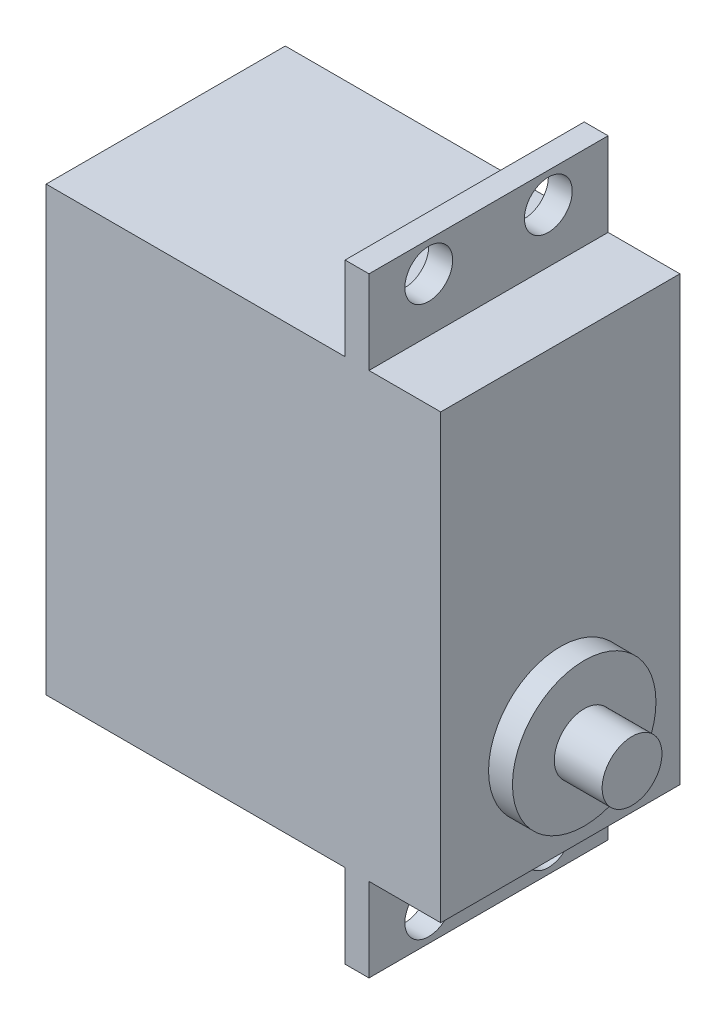
ISO-10303-21;
HEADER;
FILE_DESCRIPTION(('STEP AP214'),'2;1');
FILE_NAME('part.step','',(''),(''),'','','');
FILE_SCHEMA(('AUTOMOTIVE_DESIGN { 1 0 10303 214 1 1 1 1 }'));
ENDSEC;
DATA;
#1=APPLICATION_CONTEXT('core data for automotive mechanical design processes');
#2=APPLICATION_PROTOCOL_DEFINITION('international standard','automotive_design',2000,#1);
#3=PRODUCT_CONTEXT('',#1,'mechanical');
#4=PRODUCT('Part','Part','',(#3));
#5=PRODUCT_RELATED_PRODUCT_CATEGORY('part','',(#4));
#6=PRODUCT_DEFINITION_FORMATION('','',#4);
#7=PRODUCT_DEFINITION_CONTEXT('part definition',#1,'design');
#8=PRODUCT_DEFINITION('design','',#6,#7);
#9=PRODUCT_DEFINITION_SHAPE('','',#8);
#10=(LENGTH_UNIT() NAMED_UNIT(*) SI_UNIT(.MILLI.,.METRE.));
#11=(NAMED_UNIT(*) PLANE_ANGLE_UNIT() SI_UNIT($,.RADIAN.));
#12=(NAMED_UNIT(*) SI_UNIT($,.STERADIAN.) SOLID_ANGLE_UNIT());
#13=UNCERTAINTY_MEASURE_WITH_UNIT(LENGTH_MEASURE(1.E-05),#10,'distance_accuracy_value','');
#14=(GEOMETRIC_REPRESENTATION_CONTEXT(3) GLOBAL_UNCERTAINTY_ASSIGNED_CONTEXT((#13)) GLOBAL_UNIT_ASSIGNED_CONTEXT((#10,
#11,#12)) REPRESENTATION_CONTEXT('',''));
#15=CARTESIAN_POINT('',(0.,0.,0.));
#16=DIRECTION('',(0.,0.,1.));
#17=DIRECTION('',(1.,0.,0.));
#18=AXIS2_PLACEMENT_3D('',#15,#16,#17);
#19=CARTESIAN_POINT('',(0.,37.,0.));
#20=DIRECTION('',(0.,1.,0.));
#21=DIRECTION('',(0.,0.,-1.));
#22=AXIS2_PLACEMENT_3D('',#19,#20,#21);
#23=PLANE('',#22);
#24=DIRECTION('',(1.,0.,0.));
#25=VECTOR('',#24,1.);
#26=CARTESIAN_POINT('',(0.,37.,0.));
#27=LINE('',#26,#25);
#28=CARTESIAN_POINT('',(0.,37.,0.));
#29=VERTEX_POINT('',#28);
#30=CARTESIAN_POINT('',(25.,37.,0.));
#31=VERTEX_POINT('',#30);
#32=EDGE_CURVE('E176',#29,#31,#27,.T.);
#33=ORIENTED_EDGE('',*,*,#32,.T.);
#34=DIRECTION('',(0.,0.,-1.));
#35=VECTOR('',#34,1.);
#36=CARTESIAN_POINT('',(25.,37.,0.));
#37=LINE('',#36,#35);
#38=CARTESIAN_POINT('',(25.,37.,-20.));
#39=VERTEX_POINT('',#38);
#40=EDGE_CURVE('E134',#31,#39,#37,.T.);
#41=ORIENTED_EDGE('',*,*,#40,.T.);
#42=DIRECTION('',(-1.,0.,0.));
#43=VECTOR('',#42,1.);
#44=CARTESIAN_POINT('',(0.,37.,-20.));
#45=LINE('',#44,#43);
#46=CARTESIAN_POINT('',(0.,37.,-20.));
#47=VERTEX_POINT('',#46);
#48=EDGE_CURVE('E168',#39,#47,#45,.T.);
#49=ORIENTED_EDGE('',*,*,#48,.T.);
#50=DIRECTION('',(0.,0.,1.));
#51=VECTOR('',#50,1.);
#52=CARTESIAN_POINT('',(0.,37.,0.));
#53=LINE('',#52,#51);
#54=EDGE_CURVE('E139',#47,#29,#53,.T.);
#55=ORIENTED_EDGE('',*,*,#54,.T.);
#56=EDGE_LOOP('',(#33,#41,#49,#55));
#57=FACE_BOUND('',#56,.T.);
#58=ADVANCED_FACE('F37',(#57),#23,.T.);
#59=CARTESIAN_POINT('',(33.,37.,-20.));
#60=VERTEX_POINT('',#59);
#61=CARTESIAN_POINT('',(27.,37.,-20.));
#62=VERTEX_POINT('',#61);
#63=EDGE_CURVE('E169',#60,#62,#45,.T.);
#64=ORIENTED_EDGE('',*,*,#63,.T.);
#65=DIRECTION('',(0.,0.,1.));
#66=VECTOR('',#65,1.);
#67=CARTESIAN_POINT('',(27.,37.,0.));
#68=LINE('',#67,#66);
#69=CARTESIAN_POINT('',(27.,37.,0.));
#70=VERTEX_POINT('',#69);
#71=EDGE_CURVE('E148',#62,#70,#68,.T.);
#72=ORIENTED_EDGE('',*,*,#71,.T.);
#73=CARTESIAN_POINT('',(33.,37.,0.));
#74=VERTEX_POINT('',#73);
#75=EDGE_CURVE('E175',#70,#74,#27,.T.);
#76=ORIENTED_EDGE('',*,*,#75,.T.);
#77=DIRECTION('',(0.,0.,-1.));
#78=VECTOR('',#77,1.);
#79=CARTESIAN_POINT('',(33.,37.,0.));
#80=LINE('',#79,#78);
#81=EDGE_CURVE('E172',#74,#60,#80,.T.);
#82=ORIENTED_EDGE('',*,*,#81,.T.);
#83=EDGE_LOOP('',(#64,#72,#76,#82));
#84=FACE_BOUND('',#83,.T.);
#85=ADVANCED_FACE('F271',(#84),#23,.T.);
#86=CARTESIAN_POINT('',(0.,0.,0.));
#87=DIRECTION('',(0.,-1.,0.));
#88=DIRECTION('',(0.,0.,-1.));
#89=AXIS2_PLACEMENT_3D('',#86,#87,#88);
#90=PLANE('',#89);
#91=DIRECTION('',(0.,0.,-1.));
#92=VECTOR('',#91,1.);
#93=CARTESIAN_POINT('',(25.,0.,0.));
#94=LINE('',#93,#92);
#95=CARTESIAN_POINT('',(25.,0.,0.));
#96=VERTEX_POINT('',#95);
#97=CARTESIAN_POINT('',(25.,0.,-20.));
#98=VERTEX_POINT('',#97);
#99=EDGE_CURVE('E61',#96,#98,#94,.T.);
#100=ORIENTED_EDGE('',*,*,#99,.F.);
#101=DIRECTION('',(1.,0.,0.));
#102=VECTOR('',#101,1.);
#103=CARTESIAN_POINT('',(0.,0.,0.));
#104=LINE('',#103,#102);
#105=CARTESIAN_POINT('',(0.,0.,0.));
#106=VERTEX_POINT('',#105);
#107=EDGE_CURVE('E207',#106,#96,#104,.T.);
#108=ORIENTED_EDGE('',*,*,#107,.F.);
#109=DIRECTION('',(0.,0.,1.));
#110=VECTOR('',#109,1.);
#111=CARTESIAN_POINT('',(0.,0.,0.));
#112=LINE('',#111,#110);
#113=CARTESIAN_POINT('',(0.,0.,-20.));
#114=VERTEX_POINT('',#113);
#115=EDGE_CURVE('E203',#114,#106,#112,.T.);
#116=ORIENTED_EDGE('',*,*,#115,.F.);
#117=DIRECTION('',(-1.,0.,0.));
#118=VECTOR('',#117,1.);
#119=CARTESIAN_POINT('',(0.,0.,-20.));
#120=LINE('',#119,#118);
#121=EDGE_CURVE('E211',#98,#114,#120,.T.);
#122=ORIENTED_EDGE('',*,*,#121,.F.);
#123=EDGE_LOOP('',(#100,#108,#116,#122));
#124=FACE_BOUND('',#123,.T.);
#125=ADVANCED_FACE('F267',(#124),#90,.T.);
#126=CARTESIAN_POINT('',(0.,18.5,0.));
#127=DIRECTION('',(1.,0.,0.));
#128=DIRECTION('',(0.,0.,-1.));
#129=AXIS2_PLACEMENT_3D('',#126,#127,#128);
#130=PLANE('',#129);
#131=ORIENTED_EDGE('',*,*,#115,.T.);
#132=DIRECTION('',(0.,-1.,0.));
#133=VECTOR('',#132,1.);
#134=CARTESIAN_POINT('',(0.,18.5,0.));
#135=LINE('',#134,#133);
#136=EDGE_CURVE('E223',#29,#106,#135,.T.);
#137=ORIENTED_EDGE('',*,*,#136,.F.);
#138=ORIENTED_EDGE('',*,*,#54,.F.);
#139=DIRECTION('',(0.,-1.,0.));
#140=VECTOR('',#139,1.);
#141=CARTESIAN_POINT('',(0.,18.5,-20.));
#142=LINE('',#141,#140);
#143=EDGE_CURVE('E215',#47,#114,#142,.T.);
#144=ORIENTED_EDGE('',*,*,#143,.T.);
#145=EDGE_LOOP('',(#131,#137,#138,#144));
#146=FACE_BOUND('',#145,.T.);
#147=ADVANCED_FACE('F39',(#146),#130,.F.);
#148=CARTESIAN_POINT('',(0.,18.5,0.));
#149=DIRECTION('',(0.,0.,-1.));
#150=DIRECTION('',(-1.,0.,0.));
#151=AXIS2_PLACEMENT_3D('',#148,#149,#150);
#152=PLANE('',#151);
#153=ORIENTED_EDGE('',*,*,#107,.T.);
#154=DIRECTION('',(0.,1.,0.));
#155=VECTOR('',#154,1.);
#156=CARTESIAN_POINT('',(25.,-7.,0.));
#157=LINE('',#156,#155);
#158=CARTESIAN_POINT('',(25.,-7.,0.));
#159=VERTEX_POINT('',#158);
#160=EDGE_CURVE('E188',#159,#96,#157,.T.);
#161=ORIENTED_EDGE('',*,*,#160,.F.);
#162=DIRECTION('',(-1.,0.,0.));
#163=VECTOR('',#162,1.);
#164=CARTESIAN_POINT('',(25.,-7.,0.));
#165=LINE('',#164,#163);
#166=CARTESIAN_POINT('',(27.,-7.,0.));
#167=VERTEX_POINT('',#166);
#168=EDGE_CURVE('E186',#167,#159,#165,.T.);
#169=ORIENTED_EDGE('',*,*,#168,.F.);
#170=DIRECTION('',(0.,1.,0.));
#171=VECTOR('',#170,1.);
#172=CARTESIAN_POINT('',(27.,-7.,0.));
#173=LINE('',#172,#171);
#174=CARTESIAN_POINT('',(27.,0.,0.));
#175=VERTEX_POINT('',#174);
#176=EDGE_CURVE('E194',#167,#175,#173,.T.);
#177=ORIENTED_EDGE('',*,*,#176,.T.);
#178=CARTESIAN_POINT('',(33.,0.,0.));
#179=VERTEX_POINT('',#178);
#180=EDGE_CURVE('E206',#175,#179,#104,.T.);
#181=ORIENTED_EDGE('',*,*,#180,.T.);
#182=DIRECTION('',(0.,-1.,0.));
#183=VECTOR('',#182,1.);
#184=CARTESIAN_POINT('',(33.,18.5,0.));
#185=LINE('',#184,#183);
#186=EDGE_CURVE('E221',#74,#179,#185,.T.);
#187=ORIENTED_EDGE('',*,*,#186,.F.);
#188=ORIENTED_EDGE('',*,*,#75,.F.);
#189=DIRECTION('',(0.,-1.,0.));
#190=VECTOR('',#189,1.);
#191=CARTESIAN_POINT('',(27.,44.,0.));
#192=LINE('',#191,#190);
#193=CARTESIAN_POINT('',(27.,44.,0.));
#194=VERTEX_POINT('',#193);
#195=EDGE_CURVE('E53',#194,#70,#192,.T.);
#196=ORIENTED_EDGE('',*,*,#195,.F.);
#197=DIRECTION('',(-1.,0.,0.));
#198=VECTOR('',#197,1.);
#199=CARTESIAN_POINT('',(25.,44.,0.));
#200=LINE('',#199,#198);
#201=CARTESIAN_POINT('',(25.,44.,0.));
#202=VERTEX_POINT('',#201);
#203=EDGE_CURVE('E145',#194,#202,#200,.T.);
#204=ORIENTED_EDGE('',*,*,#203,.T.);
#205=DIRECTION('',(0.,-1.,0.));
#206=VECTOR('',#205,1.);
#207=CARTESIAN_POINT('',(25.,44.,0.));
#208=LINE('',#207,#206);
#209=EDGE_CURVE('E128',#202,#31,#208,.T.);
#210=ORIENTED_EDGE('',*,*,#209,.T.);
#211=ORIENTED_EDGE('',*,*,#32,.F.);
#212=ORIENTED_EDGE('',*,*,#136,.T.);
#213=EDGE_LOOP('',(#153,#161,#169,#177,#181,#187,#188,#196,#204,#210,#211,#212));
#214=FACE_BOUND('',#213,.T.);
#215=ADVANCED_FACE('F150',(#214),#152,.F.);
#216=CARTESIAN_POINT('',(33.,18.5,0.));
#217=DIRECTION('',(-1.,0.,0.));
#218=DIRECTION('',(0.,0.,1.));
#219=AXIS2_PLACEMENT_3D('',#216,#217,#218);
#220=PLANE('',#219);
#221=CARTESIAN_POINT('',(33.,9.,-10.));
#222=DIRECTION('',(-1.,0.,0.));
#223=DIRECTION('',(0.,0.,1.));
#224=AXIS2_PLACEMENT_3D('',#221,#222,#223);
#225=CIRCLE('',#224,6.);
#226=CARTESIAN_POINT('',(33.,9.,-4.));
#227=VERTEX_POINT('',#226);
#228=EDGE_CURVE('E41',#227,#227,#225,.F.);
#229=ORIENTED_EDGE('',*,*,#228,.F.);
#230=EDGE_LOOP('',(#229));
#231=FACE_BOUND('',#230,.T.);
#232=DIRECTION('',(0.,0.,-1.));
#233=VECTOR('',#232,1.);
#234=CARTESIAN_POINT('',(33.,0.,0.));
#235=LINE('',#234,#233);
#236=CARTESIAN_POINT('',(33.,0.,-20.));
#237=VERTEX_POINT('',#236);
#238=EDGE_CURVE('E209',#179,#237,#235,.T.);
#239=ORIENTED_EDGE('',*,*,#238,.T.);
#240=DIRECTION('',(0.,-1.,0.));
#241=VECTOR('',#240,1.);
#242=CARTESIAN_POINT('',(33.,18.5,-20.));
#243=LINE('',#242,#241);
#244=EDGE_CURVE('E218',#60,#237,#243,.T.);
#245=ORIENTED_EDGE('',*,*,#244,.F.);
#246=ORIENTED_EDGE('',*,*,#81,.F.);
#247=ORIENTED_EDGE('',*,*,#186,.T.);
#248=EDGE_LOOP('',(#239,#245,#246,#247));
#249=FACE_BOUND('',#248,.T.);
#250=ADVANCED_FACE('F230',(#231,#249),#220,.F.);
#251=CARTESIAN_POINT('',(0.,18.5,-20.));
#252=DIRECTION('',(0.,0.,1.));
#253=DIRECTION('',(1.,0.,0.));
#254=AXIS2_PLACEMENT_3D('',#251,#252,#253);
#255=PLANE('',#254);
#256=CARTESIAN_POINT('',(27.,0.,-20.));
#257=VERTEX_POINT('',#256);
#258=EDGE_CURVE('E212',#237,#257,#120,.T.);
#259=ORIENTED_EDGE('',*,*,#258,.T.);
#260=DIRECTION('',(0.,1.,0.));
#261=VECTOR('',#260,1.);
#262=CARTESIAN_POINT('',(27.,-7.,-20.));
#263=LINE('',#262,#261);
#264=CARTESIAN_POINT('',(27.,-7.,-20.));
#265=VERTEX_POINT('',#264);
#266=EDGE_CURVE('E197',#265,#257,#263,.T.);
#267=ORIENTED_EDGE('',*,*,#266,.F.);
#268=DIRECTION('',(1.,0.,0.));
#269=VECTOR('',#268,1.);
#270=CARTESIAN_POINT('',(25.,-7.,-20.));
#271=LINE('',#270,#269);
#272=CARTESIAN_POINT('',(25.,-7.,-20.));
#273=VERTEX_POINT('',#272);
#274=EDGE_CURVE('E181',#273,#265,#271,.T.);
#275=ORIENTED_EDGE('',*,*,#274,.F.);
#276=DIRECTION('',(0.,1.,0.));
#277=VECTOR('',#276,1.);
#278=CARTESIAN_POINT('',(25.,-7.,-20.));
#279=LINE('',#278,#277);
#280=EDGE_CURVE('E200',#273,#98,#279,.T.);
#281=ORIENTED_EDGE('',*,*,#280,.T.);
#282=ORIENTED_EDGE('',*,*,#121,.T.);
#283=ORIENTED_EDGE('',*,*,#143,.F.);
#284=ORIENTED_EDGE('',*,*,#48,.F.);
#285=DIRECTION('',(0.,-1.,0.));
#286=VECTOR('',#285,1.);
#287=CARTESIAN_POINT('',(25.,44.,-20.));
#288=LINE('',#287,#286);
#289=CARTESIAN_POINT('',(25.,44.,-20.));
#290=VERTEX_POINT('',#289);
#291=EDGE_CURVE('E158',#290,#39,#288,.T.);
#292=ORIENTED_EDGE('',*,*,#291,.F.);
#293=DIRECTION('',(1.,0.,0.));
#294=VECTOR('',#293,1.);
#295=CARTESIAN_POINT('',(25.,44.,-20.));
#296=LINE('',#295,#294);
#297=CARTESIAN_POINT('',(27.,44.,-20.));
#298=VERTEX_POINT('',#297);
#299=EDGE_CURVE('E147',#290,#298,#296,.T.);
#300=ORIENTED_EDGE('',*,*,#299,.T.);
#301=DIRECTION('',(0.,-1.,0.));
#302=VECTOR('',#301,1.);
#303=CARTESIAN_POINT('',(27.,44.,-20.));
#304=LINE('',#303,#302);
#305=EDGE_CURVE('E163',#298,#62,#304,.T.);
#306=ORIENTED_EDGE('',*,*,#305,.T.);
#307=ORIENTED_EDGE('',*,*,#63,.F.);
#308=ORIENTED_EDGE('',*,*,#244,.T.);
#309=EDGE_LOOP('',(#259,#267,#275,#281,#282,#283,#284,#292,#300,#306,#307,#308));
#310=FACE_BOUND('',#309,.T.);
#311=ADVANCED_FACE('F233',(#310),#255,.F.);
#312=DIRECTION('',(0.,0.,1.));
#313=VECTOR('',#312,1.);
#314=CARTESIAN_POINT('',(27.,0.,0.));
#315=LINE('',#314,#313);
#316=EDGE_CURVE('E182',#257,#175,#315,.T.);
#317=ORIENTED_EDGE('',*,*,#316,.F.);
#318=ORIENTED_EDGE('',*,*,#258,.F.);
#319=ORIENTED_EDGE('',*,*,#238,.F.);
#320=ORIENTED_EDGE('',*,*,#180,.F.);
#321=EDGE_LOOP('',(#317,#318,#319,#320));
#322=FACE_BOUND('',#321,.T.);
#323=ADVANCED_FACE('F243',(#322),#90,.T.);
#324=CARTESIAN_POINT('',(25.,-7.,0.));
#325=DIRECTION('',(1.,0.,0.));
#326=DIRECTION('',(0.,0.,-1.));
#327=AXIS2_PLACEMENT_3D('',#324,#325,#326);
#328=PLANE('',#327);
#329=CARTESIAN_POINT('',(25.,-4.5,-15.));
#330=DIRECTION('',(1.,0.,0.));
#331=DIRECTION('',(0.,0.,-1.));
#332=AXIS2_PLACEMENT_3D('',#329,#330,#331);
#333=CIRCLE('',#332,2.);
#334=CARTESIAN_POINT('',(25.,-4.5,-17.));
#335=VERTEX_POINT('',#334);
#336=EDGE_CURVE('E303',#335,#335,#333,.T.);
#337=ORIENTED_EDGE('',*,*,#336,.T.);
#338=EDGE_LOOP('',(#337));
#339=FACE_BOUND('',#338,.T.);
#340=CARTESIAN_POINT('',(25.,-4.5,-5.));
#341=DIRECTION('',(1.,0.,0.));
#342=DIRECTION('',(0.,0.,-1.));
#343=AXIS2_PLACEMENT_3D('',#340,#341,#342);
#344=CIRCLE('',#343,2.);
#345=CARTESIAN_POINT('',(25.,-4.5,-7.));
#346=VERTEX_POINT('',#345);
#347=EDGE_CURVE('E313',#346,#346,#344,.T.);
#348=ORIENTED_EDGE('',*,*,#347,.T.);
#349=EDGE_LOOP('',(#348));
#350=FACE_BOUND('',#349,.T.);
#351=ORIENTED_EDGE('',*,*,#99,.T.);
#352=ORIENTED_EDGE('',*,*,#280,.F.);
#353=DIRECTION('',(0.,0.,-1.));
#354=VECTOR('',#353,1.);
#355=CARTESIAN_POINT('',(25.,-7.,0.));
#356=LINE('',#355,#354);
#357=EDGE_CURVE('E178',#159,#273,#356,.T.);
#358=ORIENTED_EDGE('',*,*,#357,.F.);
#359=ORIENTED_EDGE('',*,*,#160,.T.);
#360=EDGE_LOOP('',(#351,#352,#358,#359));
#361=FACE_BOUND('',#360,.T.);
#362=ADVANCED_FACE('F256',(#339,#350,#361),#328,.F.);
#363=CARTESIAN_POINT('',(27.,-7.,0.));
#364=DIRECTION('',(-1.,0.,0.));
#365=DIRECTION('',(0.,0.,1.));
#366=AXIS2_PLACEMENT_3D('',#363,#364,#365);
#367=PLANE('',#366);
#368=CARTESIAN_POINT('',(27.,-4.5,-15.));
#369=DIRECTION('',(1.,0.,0.));
#370=DIRECTION('',(0.,0.,-1.));
#371=AXIS2_PLACEMENT_3D('',#368,#369,#370);
#372=CIRCLE('',#371,2.);
#373=CARTESIAN_POINT('',(27.,-4.5,-17.));
#374=VERTEX_POINT('',#373);
#375=EDGE_CURVE('E299',#374,#374,#372,.T.);
#376=ORIENTED_EDGE('',*,*,#375,.F.);
#377=EDGE_LOOP('',(#376));
#378=FACE_BOUND('',#377,.T.);
#379=CARTESIAN_POINT('',(27.,-4.5,-5.));
#380=DIRECTION('',(1.,0.,0.));
#381=DIRECTION('',(0.,0.,-1.));
#382=AXIS2_PLACEMENT_3D('',#379,#380,#381);
#383=CIRCLE('',#382,2.);
#384=CARTESIAN_POINT('',(27.,-4.5,-7.));
#385=VERTEX_POINT('',#384);
#386=EDGE_CURVE('E310',#385,#385,#383,.T.);
#387=ORIENTED_EDGE('',*,*,#386,.F.);
#388=EDGE_LOOP('',(#387));
#389=FACE_BOUND('',#388,.T.);
#390=ORIENTED_EDGE('',*,*,#316,.T.);
#391=ORIENTED_EDGE('',*,*,#176,.F.);
#392=DIRECTION('',(0.,0.,1.));
#393=VECTOR('',#392,1.);
#394=CARTESIAN_POINT('',(27.,-7.,0.));
#395=LINE('',#394,#393);
#396=EDGE_CURVE('E184',#265,#167,#395,.T.);
#397=ORIENTED_EDGE('',*,*,#396,.F.);
#398=ORIENTED_EDGE('',*,*,#266,.T.);
#399=EDGE_LOOP('',(#390,#391,#397,#398));
#400=FACE_BOUND('',#399,.T.);
#401=ADVANCED_FACE('F246',(#378,#389,#400),#367,.F.);
#402=CARTESIAN_POINT('',(0.,-7.,0.));
#403=DIRECTION('',(0.,-1.,0.));
#404=DIRECTION('',(0.,0.,-1.));
#405=AXIS2_PLACEMENT_3D('',#402,#403,#404);
#406=PLANE('',#405);
#407=ORIENTED_EDGE('',*,*,#357,.T.);
#408=ORIENTED_EDGE('',*,*,#274,.T.);
#409=ORIENTED_EDGE('',*,*,#396,.T.);
#410=ORIENTED_EDGE('',*,*,#168,.T.);
#411=EDGE_LOOP('',(#407,#408,#409,#410));
#412=FACE_BOUND('',#411,.T.);
#413=ADVANCED_FACE('F252',(#412),#406,.T.);
#414=CARTESIAN_POINT('',(25.,44.,0.));
#415=DIRECTION('',(-1.,0.,0.));
#416=DIRECTION('',(0.,0.,1.));
#417=AXIS2_PLACEMENT_3D('',#414,#415,#416);
#418=PLANE('',#417);
#419=CARTESIAN_POINT('',(25.,41.5,-15.));
#420=DIRECTION('',(-1.,0.,0.));
#421=DIRECTION('',(0.,0.,1.));
#422=AXIS2_PLACEMENT_3D('',#419,#420,#421);
#423=CIRCLE('',#422,2.);
#424=CARTESIAN_POINT('',(25.,41.5,-13.));
#425=VERTEX_POINT('',#424);
#426=EDGE_CURVE('E294',#425,#425,#423,.T.);
#427=ORIENTED_EDGE('',*,*,#426,.F.);
#428=EDGE_LOOP('',(#427));
#429=FACE_BOUND('',#428,.T.);
#430=CARTESIAN_POINT('',(25.,41.5,-5.));
#431=DIRECTION('',(-1.,0.,0.));
#432=DIRECTION('',(0.,0.,1.));
#433=AXIS2_PLACEMENT_3D('',#430,#431,#432);
#434=CIRCLE('',#433,2.);
#435=CARTESIAN_POINT('',(25.,41.5,-3.));
#436=VERTEX_POINT('',#435);
#437=EDGE_CURVE('E297',#436,#436,#434,.T.);
#438=ORIENTED_EDGE('',*,*,#437,.F.);
#439=EDGE_LOOP('',(#438));
#440=FACE_BOUND('',#439,.T.);
#441=ORIENTED_EDGE('',*,*,#40,.F.);
#442=ORIENTED_EDGE('',*,*,#209,.F.);
#443=DIRECTION('',(0.,0.,-1.));
#444=VECTOR('',#443,1.);
#445=CARTESIAN_POINT('',(25.,44.,0.));
#446=LINE('',#445,#444);
#447=EDGE_CURVE('E131',#202,#290,#446,.T.);
#448=ORIENTED_EDGE('',*,*,#447,.T.);
#449=ORIENTED_EDGE('',*,*,#291,.T.);
#450=EDGE_LOOP('',(#441,#442,#448,#449));
#451=FACE_BOUND('',#450,.T.);
#452=ADVANCED_FACE('F130',(#429,#440,#451),#418,.T.);
#453=CARTESIAN_POINT('',(27.,44.,0.));
#454=DIRECTION('',(1.,0.,0.));
#455=DIRECTION('',(0.,0.,-1.));
#456=AXIS2_PLACEMENT_3D('',#453,#454,#455);
#457=PLANE('',#456);
#458=CARTESIAN_POINT('',(27.,41.5,-15.));
#459=DIRECTION('',(1.,0.,0.));
#460=DIRECTION('',(0.,0.,-1.));
#461=AXIS2_PLACEMENT_3D('',#458,#459,#460);
#462=CIRCLE('',#461,2.);
#463=CARTESIAN_POINT('',(27.,41.5,-17.));
#464=VERTEX_POINT('',#463);
#465=EDGE_CURVE('E361',#464,#464,#462,.T.);
#466=ORIENTED_EDGE('',*,*,#465,.F.);
#467=EDGE_LOOP('',(#466));
#468=FACE_BOUND('',#467,.T.);
#469=CARTESIAN_POINT('',(27.,41.5,-5.));
#470=DIRECTION('',(1.,0.,0.));
#471=DIRECTION('',(0.,0.,-1.));
#472=AXIS2_PLACEMENT_3D('',#469,#470,#471);
#473=CIRCLE('',#472,2.);
#474=CARTESIAN_POINT('',(27.,41.5,-7.));
#475=VERTEX_POINT('',#474);
#476=EDGE_CURVE('E300',#475,#475,#473,.T.);
#477=ORIENTED_EDGE('',*,*,#476,.F.);
#478=EDGE_LOOP('',(#477));
#479=FACE_BOUND('',#478,.T.);
#480=ORIENTED_EDGE('',*,*,#71,.F.);
#481=ORIENTED_EDGE('',*,*,#305,.F.);
#482=DIRECTION('',(0.,0.,1.));
#483=VECTOR('',#482,1.);
#484=CARTESIAN_POINT('',(27.,44.,0.));
#485=LINE('',#484,#483);
#486=EDGE_CURVE('E152',#298,#194,#485,.T.);
#487=ORIENTED_EDGE('',*,*,#486,.T.);
#488=ORIENTED_EDGE('',*,*,#195,.T.);
#489=EDGE_LOOP('',(#480,#481,#487,#488));
#490=FACE_BOUND('',#489,.T.);
#491=ADVANCED_FACE('F285',(#468,#479,#490),#457,.T.);
#492=CARTESIAN_POINT('',(0.,44.,0.));
#493=DIRECTION('',(0.,1.,0.));
#494=DIRECTION('',(0.,0.,-1.));
#495=AXIS2_PLACEMENT_3D('',#492,#493,#494);
#496=PLANE('',#495);
#497=ORIENTED_EDGE('',*,*,#447,.F.);
#498=ORIENTED_EDGE('',*,*,#203,.F.);
#499=ORIENTED_EDGE('',*,*,#486,.F.);
#500=ORIENTED_EDGE('',*,*,#299,.F.);
#501=EDGE_LOOP('',(#497,#498,#499,#500));
#502=FACE_BOUND('',#501,.T.);
#503=ADVANCED_FACE('F143',(#502),#496,.T.);
#504=CARTESIAN_POINT('',(35.,9.,-10.));
#505=DIRECTION('',(-1.,0.,0.));
#506=DIRECTION('',(0.,0.,1.));
#507=AXIS2_PLACEMENT_3D('',#504,#505,#506);
#508=CYLINDRICAL_SURFACE('',#507,6.);
#509=CARTESIAN_POINT('',(35.,9.,-10.));
#510=DIRECTION('',(1.,0.,0.));
#511=DIRECTION('',(0.,0.,-1.));
#512=AXIS2_PLACEMENT_3D('',#509,#510,#511);
#513=CIRCLE('',#512,6.);
#514=CARTESIAN_POINT('',(35.,9.,-16.));
#515=VERTEX_POINT('',#514);
#516=EDGE_CURVE('E160',#515,#515,#513,.T.);
#517=ORIENTED_EDGE('',*,*,#516,.F.);
#518=EDGE_LOOP('',(#517));
#519=FACE_BOUND('',#518,.T.);
#520=ORIENTED_EDGE('',*,*,#228,.T.);
#521=EDGE_LOOP('',(#520));
#522=FACE_BOUND('',#521,.T.);
#523=ADVANCED_FACE('F228',(#519,#522),#508,.T.);
#524=CARTESIAN_POINT('',(35.,9.,-10.));
#525=DIRECTION('',(1.,0.,0.));
#526=DIRECTION('',(0.,0.,-1.));
#527=AXIS2_PLACEMENT_3D('',#524,#525,#526);
#528=PLANE('',#527);
#529=CARTESIAN_POINT('',(35.,9.,-10.));
#530=DIRECTION('',(1.,0.,0.));
#531=DIRECTION('',(0.,0.,-1.));
#532=AXIS2_PLACEMENT_3D('',#529,#530,#531);
#533=CIRCLE('',#532,2.5);
#534=CARTESIAN_POINT('',(35.,9.,-12.5));
#535=VERTEX_POINT('',#534);
#536=EDGE_CURVE('E11',#535,#535,#533,.T.);
#537=ORIENTED_EDGE('',*,*,#536,.F.);
#538=EDGE_LOOP('',(#537));
#539=FACE_BOUND('',#538,.T.);
#540=ORIENTED_EDGE('',*,*,#516,.T.);
#541=EDGE_LOOP('',(#540));
#542=FACE_BOUND('',#541,.T.);
#543=ADVANCED_FACE('F321',(#539,#542),#528,.T.);
#544=CARTESIAN_POINT('',(39.,9.,-10.));
#545=DIRECTION('',(-1.,0.,0.));
#546=DIRECTION('',(0.,0.,1.));
#547=AXIS2_PLACEMENT_3D('',#544,#545,#546);
#548=CYLINDRICAL_SURFACE('',#547,2.5);
#549=CARTESIAN_POINT('',(39.,9.,-10.));
#550=DIRECTION('',(1.,0.,0.));
#551=DIRECTION('',(0.,0.,-1.));
#552=AXIS2_PLACEMENT_3D('',#549,#550,#551);
#553=CIRCLE('',#552,2.5);
#554=CARTESIAN_POINT('',(39.,9.,-12.5));
#555=VERTEX_POINT('',#554);
#556=EDGE_CURVE('E316',#555,#555,#553,.T.);
#557=ORIENTED_EDGE('',*,*,#556,.F.);
#558=EDGE_LOOP('',(#557));
#559=FACE_BOUND('',#558,.T.);
#560=ORIENTED_EDGE('',*,*,#536,.T.);
#561=EDGE_LOOP('',(#560));
#562=FACE_BOUND('',#561,.T.);
#563=ADVANCED_FACE('F329',(#559,#562),#548,.T.);
#564=CARTESIAN_POINT('',(39.,9.,-10.));
#565=DIRECTION('',(1.,0.,0.));
#566=DIRECTION('',(0.,0.,-1.));
#567=AXIS2_PLACEMENT_3D('',#564,#565,#566);
#568=PLANE('',#567);
#569=ORIENTED_EDGE('',*,*,#556,.T.);
#570=EDGE_LOOP('',(#569));
#571=FACE_BOUND('',#570,.T.);
#572=ADVANCED_FACE('F336',(#571),#568,.T.);
#573=CARTESIAN_POINT('',(27.,-4.5,-5.));
#574=DIRECTION('',(1.,0.,0.));
#575=DIRECTION('',(0.,0.,-1.));
#576=AXIS2_PLACEMENT_3D('',#573,#574,#575);
#577=CYLINDRICAL_SURFACE('',#576,2.);
#578=ORIENTED_EDGE('',*,*,#347,.F.);
#579=EDGE_LOOP('',(#578));
#580=FACE_BOUND('',#579,.T.);
#581=ORIENTED_EDGE('',*,*,#386,.T.);
#582=EDGE_LOOP('',(#581));
#583=FACE_BOUND('',#582,.T.);
#584=ADVANCED_FACE('F340',(#580,#583),#577,.F.);
#585=CARTESIAN_POINT('',(27.,-4.5,-15.));
#586=DIRECTION('',(1.,0.,0.));
#587=DIRECTION('',(0.,0.,-1.));
#588=AXIS2_PLACEMENT_3D('',#585,#586,#587);
#589=CYLINDRICAL_SURFACE('',#588,2.);
#590=ORIENTED_EDGE('',*,*,#336,.F.);
#591=EDGE_LOOP('',(#590));
#592=FACE_BOUND('',#591,.T.);
#593=ORIENTED_EDGE('',*,*,#375,.T.);
#594=EDGE_LOOP('',(#593));
#595=FACE_BOUND('',#594,.T.);
#596=ADVANCED_FACE('F344',(#592,#595),#589,.F.);
#597=CARTESIAN_POINT('',(27.,41.5,-5.));
#598=DIRECTION('',(1.,0.,0.));
#599=DIRECTION('',(0.,0.,-1.));
#600=AXIS2_PLACEMENT_3D('',#597,#598,#599);
#601=CYLINDRICAL_SURFACE('',#600,2.);
#602=ORIENTED_EDGE('',*,*,#476,.T.);
#603=EDGE_LOOP('',(#602));
#604=FACE_BOUND('',#603,.T.);
#605=ORIENTED_EDGE('',*,*,#437,.T.);
#606=EDGE_LOOP('',(#605));
#607=FACE_BOUND('',#606,.T.);
#608=ADVANCED_FACE('F348',(#604,#607),#601,.F.);
#609=CARTESIAN_POINT('',(27.,41.5,-15.));
#610=DIRECTION('',(1.,0.,0.));
#611=DIRECTION('',(0.,0.,-1.));
#612=AXIS2_PLACEMENT_3D('',#609,#610,#611);
#613=CYLINDRICAL_SURFACE('',#612,2.);
#614=ORIENTED_EDGE('',*,*,#465,.T.);
#615=EDGE_LOOP('',(#614));
#616=FACE_BOUND('',#615,.T.);
#617=ORIENTED_EDGE('',*,*,#426,.T.);
#618=EDGE_LOOP('',(#617));
#619=FACE_BOUND('',#618,.T.);
#620=ADVANCED_FACE('F352',(#616,#619),#613,.F.);
#621=CLOSED_SHELL('',(#58,#85,#125,#147,#215,#250,#311,#323,#362,#401,#413,#452,#491,#503,#523,
#543,#563,#572,#584,#596,#608,#620));
#622=MANIFOLD_SOLID_BREP('B2',#621);
#623=ADVANCED_BREP_SHAPE_REPRESENTATION('',(#18,#622),#14);
#624=SHAPE_DEFINITION_REPRESENTATION(#9,#623);
ENDSEC;
END-ISO-10303-21;
